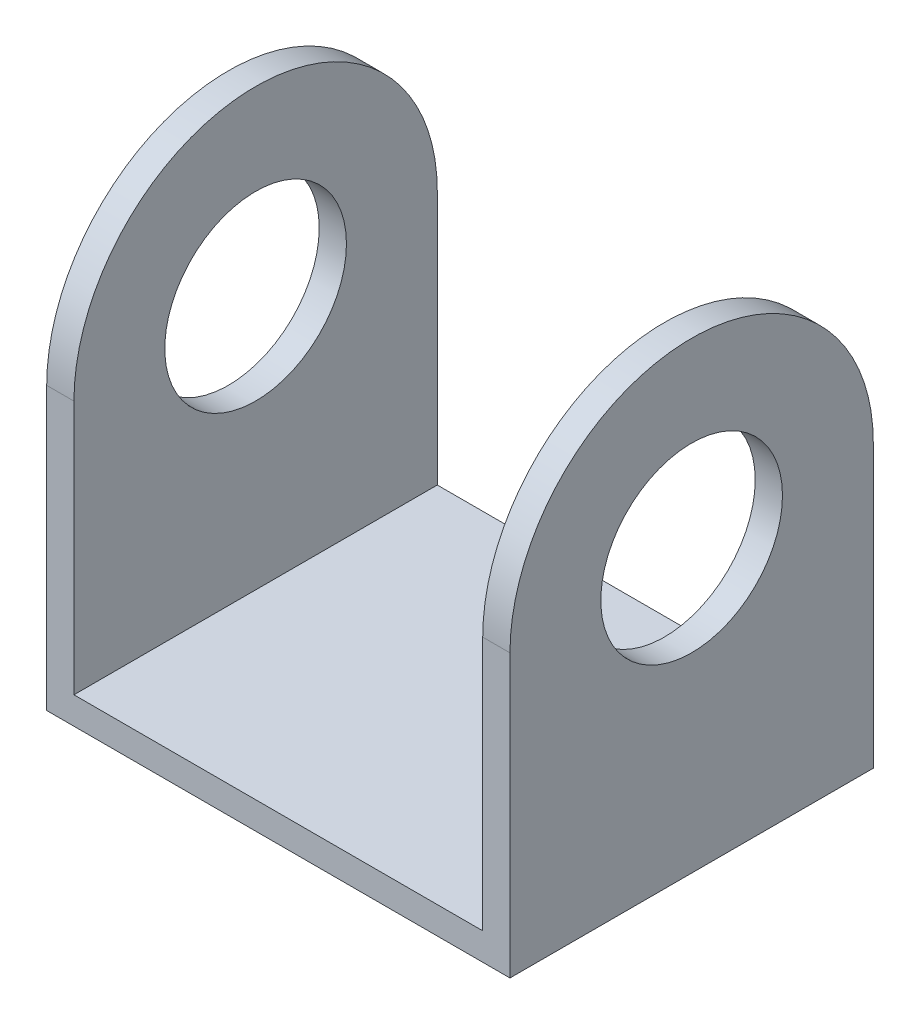
ISO-10303-21;
HEADER;
FILE_DESCRIPTION(('STEP AP214'),'2;1');
FILE_NAME('part.step','',(''),(''),'','','');
FILE_SCHEMA(('AUTOMOTIVE_DESIGN { 1 0 10303 214 1 1 1 1 }'));
ENDSEC;
DATA;
#1=APPLICATION_CONTEXT('core data for automotive mechanical design processes');
#2=APPLICATION_PROTOCOL_DEFINITION('international standard','automotive_design',2000,#1);
#3=PRODUCT_CONTEXT('',#1,'mechanical');
#4=PRODUCT('Part','Part','',(#3));
#5=PRODUCT_RELATED_PRODUCT_CATEGORY('part','',(#4));
#6=PRODUCT_DEFINITION_FORMATION('','',#4);
#7=PRODUCT_DEFINITION_CONTEXT('part definition',#1,'design');
#8=PRODUCT_DEFINITION('design','',#6,#7);
#9=PRODUCT_DEFINITION_SHAPE('','',#8);
#10=(LENGTH_UNIT() NAMED_UNIT(*) SI_UNIT(.MILLI.,.METRE.));
#11=(NAMED_UNIT(*) PLANE_ANGLE_UNIT() SI_UNIT($,.RADIAN.));
#12=(NAMED_UNIT(*) SI_UNIT($,.STERADIAN.) SOLID_ANGLE_UNIT());
#13=UNCERTAINTY_MEASURE_WITH_UNIT(LENGTH_MEASURE(1.E-05),#10,'distance_accuracy_value','');
#14=(GEOMETRIC_REPRESENTATION_CONTEXT(3) GLOBAL_UNCERTAINTY_ASSIGNED_CONTEXT((#13)) GLOBAL_UNIT_ASSIGNED_CONTEXT((#10,
#11,#12)) REPRESENTATION_CONTEXT('',''));
#15=CARTESIAN_POINT('',(0.,0.,0.));
#16=DIRECTION('',(0.,0.,1.));
#17=DIRECTION('',(1.,0.,0.));
#18=AXIS2_PLACEMENT_3D('',#15,#16,#17);
#19=CARTESIAN_POINT('',(22.5,3.,20.));
#20=DIRECTION('',(0.,0.,-1.));
#21=DIRECTION('',(-1.,0.,0.));
#22=AXIS2_PLACEMENT_3D('',#19,#20,#21);
#23=PLANE('',#22);
#24=DIRECTION('',(-1.,0.,0.));
#25=VECTOR('',#24,1.);
#26=CARTESIAN_POINT('',(22.5,3.,20.));
#27=LINE('',#26,#25);
#28=CARTESIAN_POINT('',(22.5,3.,20.));
#29=VERTEX_POINT('',#28);
#30=CARTESIAN_POINT('',(-22.5,3.,20.));
#31=VERTEX_POINT('',#30);
#32=EDGE_CURVE('E163',#29,#31,#27,.T.);
#33=ORIENTED_EDGE('',*,*,#32,.T.);
#34=DIRECTION('',(0.,-1.,0.));
#35=VECTOR('',#34,1.);
#36=CARTESIAN_POINT('',(-22.5,31.,20.));
#37=LINE('',#36,#35);
#38=CARTESIAN_POINT('',(-22.5,31.,20.));
#39=VERTEX_POINT('',#38);
#40=EDGE_CURVE('E113',#39,#31,#37,.T.);
#41=ORIENTED_EDGE('',*,*,#40,.F.);
#42=DIRECTION('',(1.,0.,0.));
#43=VECTOR('',#42,1.);
#44=CARTESIAN_POINT('',(-25.5,31.,20.));
#45=LINE('',#44,#43);
#46=CARTESIAN_POINT('',(-25.5,31.,20.));
#47=VERTEX_POINT('',#46);
#48=EDGE_CURVE('E103',#47,#39,#45,.T.);
#49=ORIENTED_EDGE('',*,*,#48,.F.);
#50=DIRECTION('',(0.,-1.,0.));
#51=VECTOR('',#50,1.);
#52=CARTESIAN_POINT('',(-25.5,31.,20.));
#53=LINE('',#52,#51);
#54=CARTESIAN_POINT('',(-25.5,0.,20.));
#55=VERTEX_POINT('',#54);
#56=EDGE_CURVE('E112',#47,#55,#53,.T.);
#57=ORIENTED_EDGE('',*,*,#56,.T.);
#58=DIRECTION('',(-1.,0.,0.));
#59=VECTOR('',#58,1.);
#60=CARTESIAN_POINT('',(22.5,0.,20.));
#61=LINE('',#60,#59);
#62=CARTESIAN_POINT('',(25.5,0.,20.));
#63=VERTEX_POINT('',#62);
#64=EDGE_CURVE('E11',#63,#55,#61,.T.);
#65=ORIENTED_EDGE('',*,*,#64,.F.);
#66=DIRECTION('',(0.,-1.,0.));
#67=VECTOR('',#66,1.);
#68=CARTESIAN_POINT('',(25.5,31.,20.));
#69=LINE('',#68,#67);
#70=CARTESIAN_POINT('',(25.5,31.,20.));
#71=VERTEX_POINT('',#70);
#72=EDGE_CURVE('E138',#71,#63,#69,.T.);
#73=ORIENTED_EDGE('',*,*,#72,.F.);
#74=DIRECTION('',(-1.,0.,0.));
#75=VECTOR('',#74,1.);
#76=CARTESIAN_POINT('',(25.5,31.,20.));
#77=LINE('',#76,#75);
#78=CARTESIAN_POINT('',(22.5,31.,20.));
#79=VERTEX_POINT('',#78);
#80=EDGE_CURVE('E156',#71,#79,#77,.T.);
#81=ORIENTED_EDGE('',*,*,#80,.T.);
#82=DIRECTION('',(0.,-1.,0.));
#83=VECTOR('',#82,1.);
#84=CARTESIAN_POINT('',(22.5,31.,20.));
#85=LINE('',#84,#83);
#86=EDGE_CURVE('E150',#79,#29,#85,.T.);
#87=ORIENTED_EDGE('',*,*,#86,.T.);
#88=EDGE_LOOP('',(#33,#41,#49,#57,#65,#73,#81,#87));
#89=FACE_BOUND('',#88,.T.);
#90=ADVANCED_FACE('F33',(#89),#23,.F.);
#91=CARTESIAN_POINT('',(22.5,0.,20.));
#92=DIRECTION('',(0.,1.,0.));
#93=DIRECTION('',(0.,0.,1.));
#94=AXIS2_PLACEMENT_3D('',#91,#92,#93);
#95=PLANE('',#94);
#96=ORIENTED_EDGE('',*,*,#64,.T.);
#97=DIRECTION('',(0.,0.,-1.));
#98=VECTOR('',#97,1.);
#99=CARTESIAN_POINT('',(-25.5,0.,20.));
#100=LINE('',#99,#98);
#101=CARTESIAN_POINT('',(-25.5,0.,-20.));
#102=VERTEX_POINT('',#101);
#103=EDGE_CURVE('E117',#55,#102,#100,.T.);
#104=ORIENTED_EDGE('',*,*,#103,.T.);
#105=DIRECTION('',(-1.,0.,0.));
#106=VECTOR('',#105,1.);
#107=CARTESIAN_POINT('',(22.5,0.,-20.));
#108=LINE('',#107,#106);
#109=CARTESIAN_POINT('',(25.5,0.,-20.));
#110=VERTEX_POINT('',#109);
#111=EDGE_CURVE('E41',#110,#102,#108,.T.);
#112=ORIENTED_EDGE('',*,*,#111,.F.);
#113=DIRECTION('',(0.,0.,-1.));
#114=VECTOR('',#113,1.);
#115=CARTESIAN_POINT('',(25.5,0.,20.));
#116=LINE('',#115,#114);
#117=EDGE_CURVE('E142',#63,#110,#116,.T.);
#118=ORIENTED_EDGE('',*,*,#117,.F.);
#119=EDGE_LOOP('',(#96,#104,#112,#118));
#120=FACE_BOUND('',#119,.T.);
#121=ADVANCED_FACE('F184',(#120),#95,.F.);
#122=CARTESIAN_POINT('',(22.5,0.,-20.));
#123=DIRECTION('',(0.,0.,1.));
#124=DIRECTION('',(1.,0.,0.));
#125=AXIS2_PLACEMENT_3D('',#122,#123,#124);
#126=PLANE('',#125);
#127=ORIENTED_EDGE('',*,*,#111,.T.);
#128=DIRECTION('',(0.,1.,0.));
#129=VECTOR('',#128,1.);
#130=CARTESIAN_POINT('',(-25.5,0.,-20.));
#131=LINE('',#130,#129);
#132=CARTESIAN_POINT('',(-25.5,31.,-20.));
#133=VERTEX_POINT('',#132);
#134=EDGE_CURVE('E109',#102,#133,#131,.T.);
#135=ORIENTED_EDGE('',*,*,#134,.T.);
#136=DIRECTION('',(1.,0.,0.));
#137=VECTOR('',#136,1.);
#138=CARTESIAN_POINT('',(-25.5,31.,-20.));
#139=LINE('',#138,#137);
#140=CARTESIAN_POINT('',(-22.5,31.,-20.));
#141=VERTEX_POINT('',#140);
#142=EDGE_CURVE('E94',#133,#141,#139,.T.);
#143=ORIENTED_EDGE('',*,*,#142,.T.);
#144=DIRECTION('',(0.,1.,0.));
#145=VECTOR('',#144,1.);
#146=CARTESIAN_POINT('',(-22.5,0.,-20.));
#147=LINE('',#146,#145);
#148=CARTESIAN_POINT('',(-22.5,3.,-20.));
#149=VERTEX_POINT('',#148);
#150=EDGE_CURVE('E124',#149,#141,#147,.T.);
#151=ORIENTED_EDGE('',*,*,#150,.F.);
#152=DIRECTION('',(-1.,0.,0.));
#153=VECTOR('',#152,1.);
#154=CARTESIAN_POINT('',(22.5,3.,-20.));
#155=LINE('',#154,#153);
#156=CARTESIAN_POINT('',(22.5,3.,-20.));
#157=VERTEX_POINT('',#156);
#158=EDGE_CURVE('E47',#157,#149,#155,.T.);
#159=ORIENTED_EDGE('',*,*,#158,.F.);
#160=DIRECTION('',(0.,1.,0.));
#161=VECTOR('',#160,1.);
#162=CARTESIAN_POINT('',(22.5,0.,-20.));
#163=LINE('',#162,#161);
#164=CARTESIAN_POINT('',(22.5,31.,-20.));
#165=VERTEX_POINT('',#164);
#166=EDGE_CURVE('E139',#157,#165,#163,.T.);
#167=ORIENTED_EDGE('',*,*,#166,.T.);
#168=DIRECTION('',(-1.,0.,0.));
#169=VECTOR('',#168,1.);
#170=CARTESIAN_POINT('',(25.5,31.,-20.));
#171=LINE('',#170,#169);
#172=CARTESIAN_POINT('',(25.5,31.,-20.));
#173=VERTEX_POINT('',#172);
#174=EDGE_CURVE('E147',#173,#165,#171,.T.);
#175=ORIENTED_EDGE('',*,*,#174,.F.);
#176=DIRECTION('',(0.,1.,0.));
#177=VECTOR('',#176,1.);
#178=CARTESIAN_POINT('',(25.5,0.,-20.));
#179=LINE('',#178,#177);
#180=EDGE_CURVE('E145',#110,#173,#179,.T.);
#181=ORIENTED_EDGE('',*,*,#180,.F.);
#182=EDGE_LOOP('',(#127,#135,#143,#151,#159,#167,#175,#181));
#183=FACE_BOUND('',#182,.T.);
#184=ADVANCED_FACE('F115',(#183),#126,.F.);
#185=CARTESIAN_POINT('',(22.5,3.,-20.));
#186=DIRECTION('',(0.,-1.,0.));
#187=DIRECTION('',(0.,0.,-1.));
#188=AXIS2_PLACEMENT_3D('',#185,#186,#187);
#189=PLANE('',#188);
#190=DIRECTION('',(0.,0.,1.));
#191=VECTOR('',#190,1.);
#192=CARTESIAN_POINT('',(-22.5,3.,-20.));
#193=LINE('',#192,#191);
#194=EDGE_CURVE('E159',#149,#31,#193,.T.);
#195=ORIENTED_EDGE('',*,*,#194,.T.);
#196=ORIENTED_EDGE('',*,*,#32,.F.);
#197=DIRECTION('',(0.,0.,1.));
#198=VECTOR('',#197,1.);
#199=CARTESIAN_POINT('',(22.5,3.,-20.));
#200=LINE('',#199,#198);
#201=EDGE_CURVE('E160',#157,#29,#200,.T.);
#202=ORIENTED_EDGE('',*,*,#201,.F.);
#203=ORIENTED_EDGE('',*,*,#158,.T.);
#204=EDGE_LOOP('',(#195,#196,#202,#203));
#205=FACE_BOUND('',#204,.T.);
#206=ADVANCED_FACE('F169',(#205),#189,.F.);
#207=CARTESIAN_POINT('',(22.5,31.,0.));
#208=DIRECTION('',(1.,0.,0.));
#209=DIRECTION('',(0.,0.,-1.));
#210=AXIS2_PLACEMENT_3D('',#207,#208,#209);
#211=PLANE('',#210);
#212=CARTESIAN_POINT('',(22.5,31.,0.));
#213=DIRECTION('',(1.,0.,0.));
#214=DIRECTION('',(0.,0.,-1.));
#215=AXIS2_PLACEMENT_3D('',#212,#213,#214);
#216=CIRCLE('',#215,10.);
#217=CARTESIAN_POINT('',(22.5,31.,-10.));
#218=VERTEX_POINT('',#217);
#219=EDGE_CURVE('E102',#218,#218,#216,.T.);
#220=ORIENTED_EDGE('',*,*,#219,.T.);
#221=EDGE_LOOP('',(#220));
#222=FACE_BOUND('',#221,.T.);
#223=ORIENTED_EDGE('',*,*,#166,.F.);
#224=ORIENTED_EDGE('',*,*,#201,.T.);
#225=ORIENTED_EDGE('',*,*,#86,.F.);
#226=CARTESIAN_POINT('',(22.5,31.,0.));
#227=DIRECTION('',(1.,0.,0.));
#228=DIRECTION('',(0.,0.,-1.));
#229=AXIS2_PLACEMENT_3D('',#226,#227,#228);
#230=CIRCLE('',#229,20.);
#231=EDGE_CURVE('E132',#165,#79,#230,.T.);
#232=ORIENTED_EDGE('',*,*,#231,.F.);
#233=EDGE_LOOP('',(#223,#224,#225,#232));
#234=FACE_BOUND('',#233,.T.);
#235=ADVANCED_FACE('F173',(#222,#234),#211,.F.);
#236=CARTESIAN_POINT('',(25.5,31.,0.));
#237=DIRECTION('',(1.,0.,0.));
#238=DIRECTION('',(0.,0.,-1.));
#239=AXIS2_PLACEMENT_3D('',#236,#237,#238);
#240=PLANE('',#239);
#241=CARTESIAN_POINT('',(25.5,31.,0.));
#242=DIRECTION('',(1.,0.,0.));
#243=DIRECTION('',(0.,0.,-1.));
#244=AXIS2_PLACEMENT_3D('',#241,#242,#243);
#245=CIRCLE('',#244,20.);
#246=EDGE_CURVE('E135',#173,#71,#245,.T.);
#247=ORIENTED_EDGE('',*,*,#246,.T.);
#248=ORIENTED_EDGE('',*,*,#72,.T.);
#249=ORIENTED_EDGE('',*,*,#117,.T.);
#250=ORIENTED_EDGE('',*,*,#180,.T.);
#251=EDGE_LOOP('',(#247,#248,#249,#250));
#252=FACE_BOUND('',#251,.T.);
#253=CARTESIAN_POINT('',(25.5,31.,0.));
#254=DIRECTION('',(1.,0.,0.));
#255=DIRECTION('',(0.,0.,-1.));
#256=AXIS2_PLACEMENT_3D('',#253,#254,#255);
#257=CIRCLE('',#256,10.);
#258=CARTESIAN_POINT('',(25.5,31.,-10.));
#259=VERTEX_POINT('',#258);
#260=EDGE_CURVE('E129',#259,#259,#257,.T.);
#261=ORIENTED_EDGE('',*,*,#260,.F.);
#262=EDGE_LOOP('',(#261));
#263=FACE_BOUND('',#262,.T.);
#264=ADVANCED_FACE('F180',(#252,#263),#240,.T.);
#265=CARTESIAN_POINT('',(25.5,31.,0.));
#266=DIRECTION('',(-1.,0.,0.));
#267=DIRECTION('',(0.,0.,1.));
#268=AXIS2_PLACEMENT_3D('',#265,#266,#267);
#269=CYLINDRICAL_SURFACE('',#268,20.);
#270=ORIENTED_EDGE('',*,*,#231,.T.);
#271=ORIENTED_EDGE('',*,*,#80,.F.);
#272=ORIENTED_EDGE('',*,*,#246,.F.);
#273=ORIENTED_EDGE('',*,*,#174,.T.);
#274=EDGE_LOOP('',(#270,#271,#272,#273));
#275=FACE_BOUND('',#274,.T.);
#276=ADVANCED_FACE('F177',(#275),#269,.T.);
#277=CARTESIAN_POINT('',(25.5,31.,0.));
#278=DIRECTION('',(-1.,0.,0.));
#279=DIRECTION('',(0.,0.,1.));
#280=AXIS2_PLACEMENT_3D('',#277,#278,#279);
#281=CYLINDRICAL_SURFACE('',#280,10.);
#282=ORIENTED_EDGE('',*,*,#260,.T.);
#283=EDGE_LOOP('',(#282));
#284=FACE_BOUND('',#283,.T.);
#285=ORIENTED_EDGE('',*,*,#219,.F.);
#286=EDGE_LOOP('',(#285));
#287=FACE_BOUND('',#286,.T.);
#288=ADVANCED_FACE('F220',(#284,#287),#281,.F.);
#289=CARTESIAN_POINT('',(-25.5,31.,0.));
#290=DIRECTION('',(1.,0.,0.));
#291=DIRECTION('',(0.,0.,-1.));
#292=AXIS2_PLACEMENT_3D('',#289,#290,#291);
#293=CYLINDRICAL_SURFACE('',#292,20.);
#294=CARTESIAN_POINT('',(-22.5,31.,0.));
#295=DIRECTION('',(1.,0.,0.));
#296=DIRECTION('',(0.,0.,-1.));
#297=AXIS2_PLACEMENT_3D('',#294,#295,#296);
#298=CIRCLE('',#297,20.);
#299=EDGE_CURVE('E100',#141,#39,#298,.T.);
#300=ORIENTED_EDGE('',*,*,#299,.F.);
#301=ORIENTED_EDGE('',*,*,#142,.F.);
#302=CARTESIAN_POINT('',(-25.5,31.,0.));
#303=DIRECTION('',(1.,0.,0.));
#304=DIRECTION('',(0.,0.,-1.));
#305=AXIS2_PLACEMENT_3D('',#302,#303,#304);
#306=CIRCLE('',#305,20.);
#307=EDGE_CURVE('E97',#133,#47,#306,.T.);
#308=ORIENTED_EDGE('',*,*,#307,.T.);
#309=ORIENTED_EDGE('',*,*,#48,.T.);
#310=EDGE_LOOP('',(#300,#301,#308,#309));
#311=FACE_BOUND('',#310,.T.);
#312=ADVANCED_FACE('F96',(#311),#293,.T.);
#313=CARTESIAN_POINT('',(-25.5,31.,0.));
#314=DIRECTION('',(-1.,0.,0.));
#315=DIRECTION('',(0.,0.,-1.));
#316=AXIS2_PLACEMENT_3D('',#313,#314,#315);
#317=PLANE('',#316);
#318=CARTESIAN_POINT('',(-25.5,31.,0.));
#319=DIRECTION('',(1.,0.,0.));
#320=DIRECTION('',(0.,0.,-1.));
#321=AXIS2_PLACEMENT_3D('',#318,#319,#320);
#322=CIRCLE('',#321,10.);
#323=CARTESIAN_POINT('',(-25.5,31.,-10.));
#324=VERTEX_POINT('',#323);
#325=EDGE_CURVE('E125',#324,#324,#322,.T.);
#326=ORIENTED_EDGE('',*,*,#325,.T.);
#327=EDGE_LOOP('',(#326));
#328=FACE_BOUND('',#327,.T.);
#329=ORIENTED_EDGE('',*,*,#307,.F.);
#330=ORIENTED_EDGE('',*,*,#134,.F.);
#331=ORIENTED_EDGE('',*,*,#103,.F.);
#332=ORIENTED_EDGE('',*,*,#56,.F.);
#333=EDGE_LOOP('',(#329,#330,#331,#332));
#334=FACE_BOUND('',#333,.T.);
#335=ADVANCED_FACE('F107',(#328,#334),#317,.T.);
#336=CARTESIAN_POINT('',(-22.5,31.,0.));
#337=DIRECTION('',(-1.,0.,0.));
#338=DIRECTION('',(0.,0.,-1.));
#339=AXIS2_PLACEMENT_3D('',#336,#337,#338);
#340=PLANE('',#339);
#341=ORIENTED_EDGE('',*,*,#194,.F.);
#342=ORIENTED_EDGE('',*,*,#150,.T.);
#343=ORIENTED_EDGE('',*,*,#299,.T.);
#344=ORIENTED_EDGE('',*,*,#40,.T.);
#345=EDGE_LOOP('',(#341,#342,#343,#344));
#346=FACE_BOUND('',#345,.T.);
#347=CARTESIAN_POINT('',(-22.5,31.,0.));
#348=DIRECTION('',(1.,0.,0.));
#349=DIRECTION('',(0.,0.,-1.));
#350=AXIS2_PLACEMENT_3D('',#347,#348,#349);
#351=CIRCLE('',#350,10.);
#352=CARTESIAN_POINT('',(-22.5,31.,-10.));
#353=VERTEX_POINT('',#352);
#354=EDGE_CURVE('E195',#353,#353,#351,.T.);
#355=ORIENTED_EDGE('',*,*,#354,.F.);
#356=EDGE_LOOP('',(#355));
#357=FACE_BOUND('',#356,.T.);
#358=ADVANCED_FACE('F188',(#346,#357),#340,.F.);
#359=CARTESIAN_POINT('',(-25.5,31.,0.));
#360=DIRECTION('',(1.,0.,0.));
#361=DIRECTION('',(0.,0.,-1.));
#362=AXIS2_PLACEMENT_3D('',#359,#360,#361);
#363=CYLINDRICAL_SURFACE('',#362,10.);
#364=ORIENTED_EDGE('',*,*,#325,.F.);
#365=EDGE_LOOP('',(#364));
#366=FACE_BOUND('',#365,.T.);
#367=ORIENTED_EDGE('',*,*,#354,.T.);
#368=EDGE_LOOP('',(#367));
#369=FACE_BOUND('',#368,.T.);
#370=ADVANCED_FACE('F191',(#366,#369),#363,.F.);
#371=CLOSED_SHELL('',(#90,#121,#184,#206,#235,#264,#276,#288,#312,#335,#358,#370));
#372=MANIFOLD_SOLID_BREP('B2',#371);
#373=ADVANCED_BREP_SHAPE_REPRESENTATION('',(#18,#372),#14);
#374=SHAPE_DEFINITION_REPRESENTATION(#9,#373);
ENDSEC;
END-ISO-10303-21;
